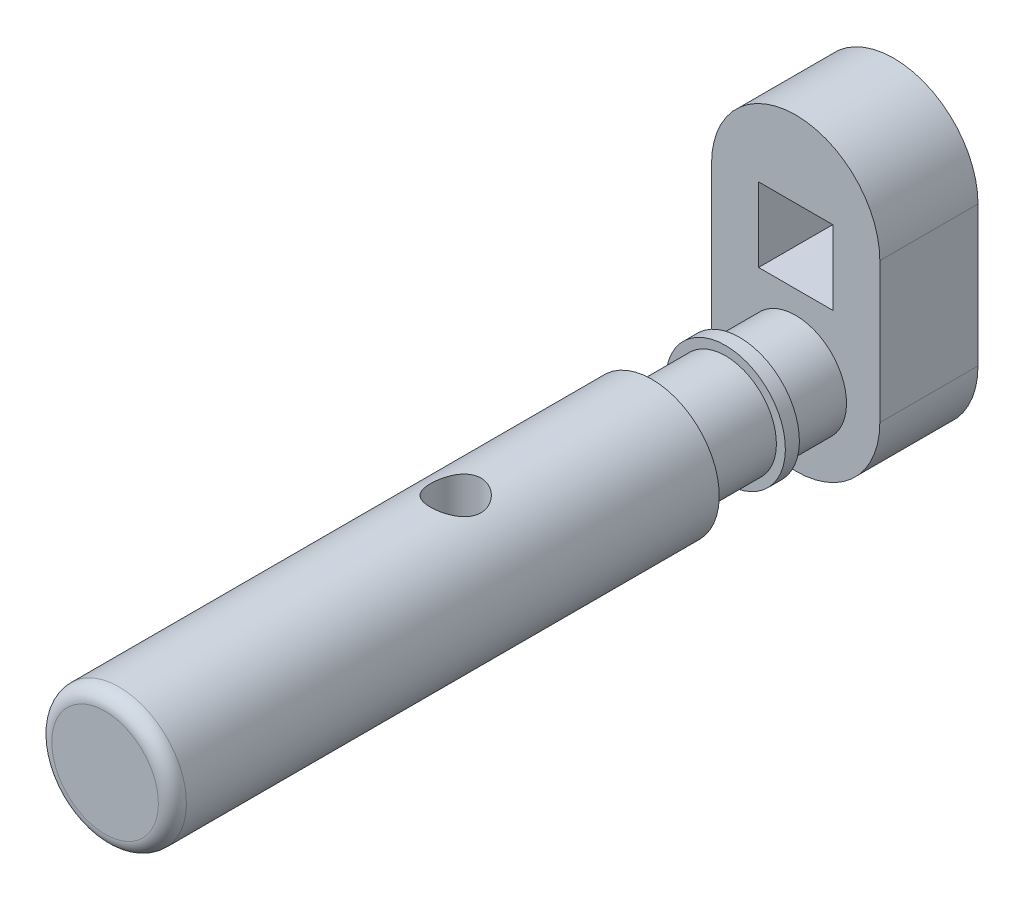
ISO-10303-21;
HEADER;
FILE_DESCRIPTION(('STEP AP214'),'2;1');
FILE_NAME('part.step','',(''),(''),'','','');
FILE_SCHEMA(('AUTOMOTIVE_DESIGN { 1 0 10303 214 1 1 1 1 }'));
ENDSEC;
DATA;
#1=APPLICATION_CONTEXT('core data for automotive mechanical design processes');
#2=APPLICATION_PROTOCOL_DEFINITION('international standard','automotive_design',2000,#1);
#3=PRODUCT_CONTEXT('',#1,'mechanical');
#4=PRODUCT('Part','Part','',(#3));
#5=PRODUCT_RELATED_PRODUCT_CATEGORY('part','',(#4));
#6=PRODUCT_DEFINITION_FORMATION('','',#4);
#7=PRODUCT_DEFINITION_CONTEXT('part definition',#1,'design');
#8=PRODUCT_DEFINITION('design','',#6,#7);
#9=PRODUCT_DEFINITION_SHAPE('','',#8);
#10=(LENGTH_UNIT() NAMED_UNIT(*) SI_UNIT(.MILLI.,.METRE.));
#11=(NAMED_UNIT(*) PLANE_ANGLE_UNIT() SI_UNIT($,.RADIAN.));
#12=(NAMED_UNIT(*) SI_UNIT($,.STERADIAN.) SOLID_ANGLE_UNIT());
#13=UNCERTAINTY_MEASURE_WITH_UNIT(LENGTH_MEASURE(1.E-05),#10,'distance_accuracy_value','');
#14=(GEOMETRIC_REPRESENTATION_CONTEXT(3) GLOBAL_UNCERTAINTY_ASSIGNED_CONTEXT((#13)) GLOBAL_UNIT_ASSIGNED_CONTEXT((#10,
#11,#12)) REPRESENTATION_CONTEXT('',''));
#15=CARTESIAN_POINT('',(0.,0.,0.));
#16=DIRECTION('',(0.,0.,1.));
#17=DIRECTION('',(1.,0.,0.));
#18=AXIS2_PLACEMENT_3D('',#15,#16,#17);
#19=CARTESIAN_POINT('',(0.,0.,7.));
#20=DIRECTION('',(0.,0.,1.));
#21=DIRECTION('',(1.,0.,0.));
#22=AXIS2_PLACEMENT_3D('',#19,#20,#21);
#23=PLANE('',#22);
#24=CARTESIAN_POINT('',(0.,-10.,7.));
#25=DIRECTION('',(0.,0.,-1.));
#26=DIRECTION('',(0.,1.,0.));
#27=AXIS2_PLACEMENT_3D('',#24,#25,#26);
#28=CIRCLE('',#27,3.625);
#29=CARTESIAN_POINT('',(0.,-6.375,7.));
#30=VERTEX_POINT('',#29);
#31=EDGE_CURVE('E136',#30,#30,#28,.T.);
#32=ORIENTED_EDGE('',*,*,#31,.T.);
#33=EDGE_LOOP('',(#32));
#34=FACE_BOUND('',#33,.T.);
#35=CARTESIAN_POINT('',(0.,0.,7.));
#36=DIRECTION('',(0.,0.,1.));
#37=DIRECTION('',(1.,0.,0.));
#38=AXIS2_PLACEMENT_3D('',#35,#36,#37);
#39=CIRCLE('',#38,6.);
#40=CARTESIAN_POINT('',(6.,0.,7.));
#41=VERTEX_POINT('',#40);
#42=CARTESIAN_POINT('',(-6.,0.,7.));
#43=VERTEX_POINT('',#42);
#44=EDGE_CURVE('E158',#41,#43,#39,.T.);
#45=ORIENTED_EDGE('',*,*,#44,.T.);
#46=DIRECTION('',(0.,-1.,0.));
#47=VECTOR('',#46,1.);
#48=CARTESIAN_POINT('',(-6.,0.,7.));
#49=LINE('',#48,#47);
#50=CARTESIAN_POINT('',(-6.,-10.,7.));
#51=VERTEX_POINT('',#50);
#52=EDGE_CURVE('E161',#43,#51,#49,.T.);
#53=ORIENTED_EDGE('',*,*,#52,.T.);
#54=CARTESIAN_POINT('',(0.,-10.,7.));
#55=DIRECTION('',(0.,0.,1.));
#56=DIRECTION('',(1.,0.,0.));
#57=AXIS2_PLACEMENT_3D('',#54,#55,#56);
#58=CIRCLE('',#57,6.);
#59=CARTESIAN_POINT('',(6.,-10.,7.));
#60=VERTEX_POINT('',#59);
#61=EDGE_CURVE('E164',#51,#60,#58,.T.);
#62=ORIENTED_EDGE('',*,*,#61,.T.);
#63=DIRECTION('',(0.,1.,0.));
#64=VECTOR('',#63,1.);
#65=CARTESIAN_POINT('',(6.,0.,7.));
#66=LINE('',#65,#64);
#67=EDGE_CURVE('E166',#60,#41,#66,.T.);
#68=ORIENTED_EDGE('',*,*,#67,.T.);
#69=EDGE_LOOP('',(#45,#53,#62,#68));
#70=FACE_BOUND('',#69,.T.);
#71=DIRECTION('',(-1.,0.,0.));
#72=VECTOR('',#71,1.);
#73=CARTESIAN_POINT('',(-2.644,0.544000000000001,7.));
#74=LINE('',#73,#72);
#75=CARTESIAN_POINT('',(2.644,0.544000000000001,7.));
#76=VERTEX_POINT('',#75);
#77=CARTESIAN_POINT('',(-2.644,0.544000000000001,7.));
#78=VERTEX_POINT('',#77);
#79=EDGE_CURVE('E135',#76,#78,#74,.T.);
#80=ORIENTED_EDGE('',*,*,#79,.F.);
#81=DIRECTION('',(0.,1.,0.));
#82=VECTOR('',#81,1.);
#83=CARTESIAN_POINT('',(2.644,-4.744,7.));
#84=LINE('',#83,#82);
#85=CARTESIAN_POINT('',(2.644,-4.744,7.));
#86=VERTEX_POINT('',#85);
#87=EDGE_CURVE('E125',#86,#76,#84,.T.);
#88=ORIENTED_EDGE('',*,*,#87,.F.);
#89=DIRECTION('',(1.,0.,0.));
#90=VECTOR('',#89,1.);
#91=CARTESIAN_POINT('',(-2.644,-4.744,7.));
#92=LINE('',#91,#90);
#93=CARTESIAN_POINT('',(-2.644,-4.744,7.));
#94=VERTEX_POINT('',#93);
#95=EDGE_CURVE('E149',#94,#86,#92,.T.);
#96=ORIENTED_EDGE('',*,*,#95,.F.);
#97=DIRECTION('',(0.,-1.,0.));
#98=VECTOR('',#97,1.);
#99=CARTESIAN_POINT('',(-2.644,-4.744,7.));
#100=LINE('',#99,#98);
#101=EDGE_CURVE('E147',#78,#94,#100,.T.);
#102=ORIENTED_EDGE('',*,*,#101,.F.);
#103=EDGE_LOOP('',(#80,#88,#96,#102));
#104=FACE_BOUND('',#103,.T.);
#105=ADVANCED_FACE('F39',(#34,#70,#104),#23,.T.);
#106=CARTESIAN_POINT('',(0.,0.,0.));
#107=DIRECTION('',(0.,0.,1.));
#108=DIRECTION('',(1.,0.,0.));
#109=AXIS2_PLACEMENT_3D('',#106,#107,#108);
#110=PLANE('',#109);
#111=DIRECTION('',(1.,0.,0.));
#112=VECTOR('',#111,1.);
#113=CARTESIAN_POINT('',(2.644,-5.744,0.));
#114=LINE('',#113,#112);
#115=CARTESIAN_POINT('',(-3.644,-5.744,0.));
#116=VERTEX_POINT('',#115);
#117=CARTESIAN_POINT('',(3.644,-5.744,0.));
#118=VERTEX_POINT('',#117);
#119=EDGE_CURVE('E191',#116,#118,#114,.T.);
#120=ORIENTED_EDGE('',*,*,#119,.T.);
#121=DIRECTION('',(0.,1.,0.));
#122=VECTOR('',#121,1.);
#123=CARTESIAN_POINT('',(3.644,0.544000000000001,0.));
#124=LINE('',#123,#122);
#125=CARTESIAN_POINT('',(3.644,1.544,0.));
#126=VERTEX_POINT('',#125);
#127=EDGE_CURVE('E193',#118,#126,#124,.T.);
#128=ORIENTED_EDGE('',*,*,#127,.T.);
#129=DIRECTION('',(-1.,0.,0.));
#130=VECTOR('',#129,1.);
#131=CARTESIAN_POINT('',(-2.644,1.544,0.));
#132=LINE('',#131,#130);
#133=CARTESIAN_POINT('',(-3.644,1.544,0.));
#134=VERTEX_POINT('',#133);
#135=EDGE_CURVE('E187',#126,#134,#132,.T.);
#136=ORIENTED_EDGE('',*,*,#135,.T.);
#137=DIRECTION('',(0.,-1.,0.));
#138=VECTOR('',#137,1.);
#139=CARTESIAN_POINT('',(-3.644,-4.744,0.));
#140=LINE('',#139,#138);
#141=EDGE_CURVE('E189',#134,#116,#140,.T.);
#142=ORIENTED_EDGE('',*,*,#141,.T.);
#143=EDGE_LOOP('',(#120,#128,#136,#142));
#144=FACE_BOUND('',#143,.T.);
#145=CARTESIAN_POINT('',(0.,0.,0.));
#146=DIRECTION('',(0.,0.,1.));
#147=DIRECTION('',(1.,0.,0.));
#148=AXIS2_PLACEMENT_3D('',#145,#146,#147);
#149=CIRCLE('',#148,6.);
#150=CARTESIAN_POINT('',(6.,0.,0.));
#151=VERTEX_POINT('',#150);
#152=CARTESIAN_POINT('',(-6.,0.,0.));
#153=VERTEX_POINT('',#152);
#154=EDGE_CURVE('E142',#151,#153,#149,.T.);
#155=ORIENTED_EDGE('',*,*,#154,.F.);
#156=DIRECTION('',(0.,1.,0.));
#157=VECTOR('',#156,1.);
#158=CARTESIAN_POINT('',(6.,0.,0.));
#159=LINE('',#158,#157);
#160=CARTESIAN_POINT('',(6.,-10.,0.));
#161=VERTEX_POINT('',#160);
#162=EDGE_CURVE('E162',#161,#151,#159,.T.);
#163=ORIENTED_EDGE('',*,*,#162,.F.);
#164=CARTESIAN_POINT('',(0.,-10.,0.));
#165=DIRECTION('',(0.,0.,1.));
#166=DIRECTION('',(1.,0.,0.));
#167=AXIS2_PLACEMENT_3D('',#164,#165,#166);
#168=CIRCLE('',#167,6.);
#169=CARTESIAN_POINT('',(-6.,-10.,0.));
#170=VERTEX_POINT('',#169);
#171=EDGE_CURVE('E173',#170,#161,#168,.T.);
#172=ORIENTED_EDGE('',*,*,#171,.F.);
#173=DIRECTION('',(0.,-1.,0.));
#174=VECTOR('',#173,1.);
#175=CARTESIAN_POINT('',(-6.,0.,0.));
#176=LINE('',#175,#174);
#177=EDGE_CURVE('E171',#153,#170,#176,.T.);
#178=ORIENTED_EDGE('',*,*,#177,.F.);
#179=EDGE_LOOP('',(#155,#163,#172,#178));
#180=FACE_BOUND('',#179,.T.);
#181=ADVANCED_FACE('F243',(#144,#180),#110,.F.);
#182=CARTESIAN_POINT('',(0.,0.,7.));
#183=DIRECTION('',(0.,0.,-1.));
#184=DIRECTION('',(-1.,0.,0.));
#185=AXIS2_PLACEMENT_3D('',#182,#183,#184);
#186=CYLINDRICAL_SURFACE('',#185,6.);
#187=ORIENTED_EDGE('',*,*,#154,.T.);
#188=DIRECTION('',(0.,0.,-1.));
#189=VECTOR('',#188,1.);
#190=CARTESIAN_POINT('',(-6.,0.,7.));
#191=LINE('',#190,#189);
#192=EDGE_CURVE('E184',#43,#153,#191,.T.);
#193=ORIENTED_EDGE('',*,*,#192,.F.);
#194=ORIENTED_EDGE('',*,*,#44,.F.);
#195=DIRECTION('',(0.,0.,-1.));
#196=VECTOR('',#195,1.);
#197=CARTESIAN_POINT('',(6.,0.,7.));
#198=LINE('',#197,#196);
#199=EDGE_CURVE('E168',#41,#151,#198,.T.);
#200=ORIENTED_EDGE('',*,*,#199,.T.);
#201=EDGE_LOOP('',(#187,#193,#194,#200));
#202=FACE_BOUND('',#201,.T.);
#203=ADVANCED_FACE('F251',(#202),#186,.T.);
#204=CARTESIAN_POINT('',(-6.,0.,7.));
#205=DIRECTION('',(1.,0.,0.));
#206=DIRECTION('',(0.,1.,0.));
#207=AXIS2_PLACEMENT_3D('',#204,#205,#206);
#208=PLANE('',#207);
#209=ORIENTED_EDGE('',*,*,#177,.T.);
#210=DIRECTION('',(0.,0.,-1.));
#211=VECTOR('',#210,1.);
#212=CARTESIAN_POINT('',(-6.,-10.,7.));
#213=LINE('',#212,#211);
#214=EDGE_CURVE('E181',#51,#170,#213,.T.);
#215=ORIENTED_EDGE('',*,*,#214,.F.);
#216=ORIENTED_EDGE('',*,*,#52,.F.);
#217=ORIENTED_EDGE('',*,*,#192,.T.);
#218=EDGE_LOOP('',(#209,#215,#216,#217));
#219=FACE_BOUND('',#218,.T.);
#220=ADVANCED_FACE('F265',(#219),#208,.F.);
#221=CARTESIAN_POINT('',(0.,-10.,7.));
#222=DIRECTION('',(0.,0.,-1.));
#223=DIRECTION('',(-1.,0.,0.));
#224=AXIS2_PLACEMENT_3D('',#221,#222,#223);
#225=CYLINDRICAL_SURFACE('',#224,6.);
#226=ORIENTED_EDGE('',*,*,#171,.T.);
#227=DIRECTION('',(0.,0.,-1.));
#228=VECTOR('',#227,1.);
#229=CARTESIAN_POINT('',(6.,-10.,7.));
#230=LINE('',#229,#228);
#231=EDGE_CURVE('E178',#60,#161,#230,.T.);
#232=ORIENTED_EDGE('',*,*,#231,.F.);
#233=ORIENTED_EDGE('',*,*,#61,.F.);
#234=ORIENTED_EDGE('',*,*,#214,.T.);
#235=EDGE_LOOP('',(#226,#232,#233,#234));
#236=FACE_BOUND('',#235,.T.);
#237=ADVANCED_FACE('F261',(#236),#225,.T.);
#238=CARTESIAN_POINT('',(6.,0.,7.));
#239=DIRECTION('',(-1.,0.,0.));
#240=DIRECTION('',(0.,0.,1.));
#241=AXIS2_PLACEMENT_3D('',#238,#239,#240);
#242=PLANE('',#241);
#243=ORIENTED_EDGE('',*,*,#162,.T.);
#244=ORIENTED_EDGE('',*,*,#199,.F.);
#245=ORIENTED_EDGE('',*,*,#67,.F.);
#246=ORIENTED_EDGE('',*,*,#231,.T.);
#247=EDGE_LOOP('',(#243,#244,#245,#246));
#248=FACE_BOUND('',#247,.T.);
#249=ADVANCED_FACE('F259',(#248),#242,.F.);
#250=CARTESIAN_POINT('',(2.644,-4.744,7.));
#251=DIRECTION('',(-1.,0.,0.));
#252=DIRECTION('',(0.,-1.,0.));
#253=AXIS2_PLACEMENT_3D('',#250,#251,#252);
#254=PLANE('',#253);
#255=DIRECTION('',(0.,0.,-1.));
#256=VECTOR('',#255,1.);
#257=CARTESIAN_POINT('',(2.644,0.544000000000001,7.));
#258=LINE('',#257,#256);
#259=CARTESIAN_POINT('',(2.644,0.544000000000001,1.));
#260=VERTEX_POINT('',#259);
#261=EDGE_CURVE('E129',#76,#260,#258,.T.);
#262=ORIENTED_EDGE('',*,*,#261,.T.);
#263=DIRECTION('',(0.,1.,0.));
#264=VECTOR('',#263,1.);
#265=CARTESIAN_POINT('',(2.644,-4.744,1.));
#266=LINE('',#265,#264);
#267=CARTESIAN_POINT('',(2.644,-4.744,1.));
#268=VERTEX_POINT('',#267);
#269=EDGE_CURVE('E196',#260,#268,#266,.F.);
#270=ORIENTED_EDGE('',*,*,#269,.T.);
#271=DIRECTION('',(0.,0.,-1.));
#272=VECTOR('',#271,1.);
#273=CARTESIAN_POINT('',(2.644,-4.744,7.));
#274=LINE('',#273,#272);
#275=EDGE_CURVE('E131',#86,#268,#274,.T.);
#276=ORIENTED_EDGE('',*,*,#275,.F.);
#277=ORIENTED_EDGE('',*,*,#87,.T.);
#278=EDGE_LOOP('',(#262,#270,#276,#277));
#279=FACE_BOUND('',#278,.T.);
#280=ADVANCED_FACE('F127',(#279),#254,.T.);
#281=CARTESIAN_POINT('',(-2.644,0.544000000000001,7.));
#282=DIRECTION('',(0.,-1.,0.));
#283=DIRECTION('',(0.,0.,-1.));
#284=AXIS2_PLACEMENT_3D('',#281,#282,#283);
#285=PLANE('',#284);
#286=DIRECTION('',(0.,0.,-1.));
#287=VECTOR('',#286,1.);
#288=CARTESIAN_POINT('',(-2.644,0.544000000000001,7.));
#289=LINE('',#288,#287);
#290=CARTESIAN_POINT('',(-2.644,0.544000000000001,1.));
#291=VERTEX_POINT('',#290);
#292=EDGE_CURVE('E143',#78,#291,#289,.T.);
#293=ORIENTED_EDGE('',*,*,#292,.T.);
#294=DIRECTION('',(-1.,0.,0.));
#295=VECTOR('',#294,1.);
#296=CARTESIAN_POINT('',(2.644,0.544000000000001,1.));
#297=LINE('',#296,#295);
#298=EDGE_CURVE('E141',#291,#260,#297,.F.);
#299=ORIENTED_EDGE('',*,*,#298,.T.);
#300=ORIENTED_EDGE('',*,*,#261,.F.);
#301=ORIENTED_EDGE('',*,*,#79,.T.);
#302=EDGE_LOOP('',(#293,#299,#300,#301));
#303=FACE_BOUND('',#302,.T.);
#304=ADVANCED_FACE('F139',(#303),#285,.T.);
#305=CARTESIAN_POINT('',(-2.644,-4.744,7.));
#306=DIRECTION('',(1.,0.,0.));
#307=DIRECTION('',(0.,0.,-1.));
#308=AXIS2_PLACEMENT_3D('',#305,#306,#307);
#309=PLANE('',#308);
#310=DIRECTION('',(0.,0.,-1.));
#311=VECTOR('',#310,1.);
#312=CARTESIAN_POINT('',(-2.644,-4.744,7.));
#313=LINE('',#312,#311);
#314=CARTESIAN_POINT('',(-2.644,-4.744,1.));
#315=VERTEX_POINT('',#314);
#316=EDGE_CURVE('E155',#94,#315,#313,.T.);
#317=ORIENTED_EDGE('',*,*,#316,.T.);
#318=DIRECTION('',(0.,-1.,0.));
#319=VECTOR('',#318,1.);
#320=CARTESIAN_POINT('',(-2.644,0.544000000000001,1.));
#321=LINE('',#320,#319);
#322=EDGE_CURVE('E60',#315,#291,#321,.F.);
#323=ORIENTED_EDGE('',*,*,#322,.T.);
#324=ORIENTED_EDGE('',*,*,#292,.F.);
#325=ORIENTED_EDGE('',*,*,#101,.T.);
#326=EDGE_LOOP('',(#317,#323,#324,#325));
#327=FACE_BOUND('',#326,.T.);
#328=ADVANCED_FACE('F293',(#327),#309,.T.);
#329=CARTESIAN_POINT('',(-2.644,-4.744,7.));
#330=DIRECTION('',(0.,1.,0.));
#331=DIRECTION('',(0.,0.,1.));
#332=AXIS2_PLACEMENT_3D('',#329,#330,#331);
#333=PLANE('',#332);
#334=ORIENTED_EDGE('',*,*,#275,.T.);
#335=DIRECTION('',(1.,0.,0.));
#336=VECTOR('',#335,1.);
#337=CARTESIAN_POINT('',(-2.644,-4.744,1.));
#338=LINE('',#337,#336);
#339=EDGE_CURVE('E68',#268,#315,#338,.F.);
#340=ORIENTED_EDGE('',*,*,#339,.T.);
#341=ORIENTED_EDGE('',*,*,#316,.F.);
#342=ORIENTED_EDGE('',*,*,#95,.T.);
#343=EDGE_LOOP('',(#334,#340,#341,#342));
#344=FACE_BOUND('',#343,.T.);
#345=ADVANCED_FACE('F292',(#344),#333,.T.);
#346=CARTESIAN_POINT('',(0.,-10.,7.));
#347=DIRECTION('',(0.,0.,-1.));
#348=DIRECTION('',(0.,1.,0.));
#349=AXIS2_PLACEMENT_3D('',#346,#347,#348);
#350=CYLINDRICAL_SURFACE('',#349,3.625);
#351=ORIENTED_EDGE('',*,*,#31,.F.);
#352=EDGE_LOOP('',(#351));
#353=FACE_BOUND('',#352,.T.);
#354=CARTESIAN_POINT('',(0.,-10.,11.));
#355=DIRECTION('',(0.,0.,-1.));
#356=DIRECTION('',(0.,1.,0.));
#357=AXIS2_PLACEMENT_3D('',#354,#355,#356);
#358=CIRCLE('',#357,3.625);
#359=CARTESIAN_POINT('',(0.,-6.375,11.));
#360=VERTEX_POINT('',#359);
#361=EDGE_CURVE('E343',#360,#360,#358,.T.);
#362=ORIENTED_EDGE('',*,*,#361,.T.);
#363=EDGE_LOOP('',(#362));
#364=FACE_BOUND('',#363,.T.);
#365=ADVANCED_FACE('F300',(#353,#364),#350,.T.);
#366=CARTESIAN_POINT('',(0.,-14.2645108906658,11.));
#367=DIRECTION('',(0.,0.,1.));
#368=DIRECTION('',(0.,-1.,0.));
#369=AXIS2_PLACEMENT_3D('',#366,#367,#368);
#370=PLANE('',#369);
#371=ORIENTED_EDGE('',*,*,#361,.F.);
#372=EDGE_LOOP('',(#371));
#373=FACE_BOUND('',#372,.T.);
#374=CARTESIAN_POINT('',(0.,-10.,11.));
#375=DIRECTION('',(0.,0.,-1.));
#376=DIRECTION('',(0.,1.,0.));
#377=AXIS2_PLACEMENT_3D('',#374,#375,#376);
#378=CIRCLE('',#377,4.26451089066583);
#379=CARTESIAN_POINT('',(0.,-5.73548910933417,11.));
#380=VERTEX_POINT('',#379);
#381=EDGE_CURVE('E340',#380,#380,#378,.T.);
#382=ORIENTED_EDGE('',*,*,#381,.T.);
#383=EDGE_LOOP('',(#382));
#384=FACE_BOUND('',#383,.T.);
#385=ADVANCED_FACE('F304',(#373,#384),#370,.F.);
#386=CARTESIAN_POINT('',(0.,-10.,7.));
#387=DIRECTION('',(0.,0.,-1.));
#388=DIRECTION('',(0.,1.,0.));
#389=AXIS2_PLACEMENT_3D('',#386,#387,#388);
#390=CYLINDRICAL_SURFACE('',#389,4.26451089066583);
#391=ORIENTED_EDGE('',*,*,#381,.F.);
#392=EDGE_LOOP('',(#391));
#393=FACE_BOUND('',#392,.T.);
#394=CARTESIAN_POINT('',(0.,-10.,12.));
#395=DIRECTION('',(0.,0.,-1.));
#396=DIRECTION('',(0.,1.,0.));
#397=AXIS2_PLACEMENT_3D('',#394,#395,#396);
#398=CIRCLE('',#397,4.26451089066583);
#399=CARTESIAN_POINT('',(0.,-5.73548910933417,12.));
#400=VERTEX_POINT('',#399);
#401=EDGE_CURVE('E337',#400,#400,#398,.T.);
#402=ORIENTED_EDGE('',*,*,#401,.T.);
#403=EDGE_LOOP('',(#402));
#404=FACE_BOUND('',#403,.T.);
#405=ADVANCED_FACE('F308',(#393,#404),#390,.T.);
#406=CARTESIAN_POINT('',(0.,-13.625,12.));
#407=DIRECTION('',(0.,0.,-1.));
#408=DIRECTION('',(0.,1.,0.));
#409=AXIS2_PLACEMENT_3D('',#406,#407,#408);
#410=PLANE('',#409);
#411=ORIENTED_EDGE('',*,*,#401,.F.);
#412=EDGE_LOOP('',(#411));
#413=FACE_BOUND('',#412,.T.);
#414=CARTESIAN_POINT('',(0.,-10.,12.));
#415=DIRECTION('',(0.,0.,-1.));
#416=DIRECTION('',(0.,1.,0.));
#417=AXIS2_PLACEMENT_3D('',#414,#415,#416);
#418=CIRCLE('',#417,3.625);
#419=CARTESIAN_POINT('',(0.,-6.375,12.));
#420=VERTEX_POINT('',#419);
#421=EDGE_CURVE('E332',#420,#420,#418,.T.);
#422=ORIENTED_EDGE('',*,*,#421,.T.);
#423=EDGE_LOOP('',(#422));
#424=FACE_BOUND('',#423,.T.);
#425=ADVANCED_FACE('F312',(#413,#424),#410,.F.);
#426=CARTESIAN_POINT('',(0.,-10.,7.));
#427=DIRECTION('',(0.,0.,-1.));
#428=DIRECTION('',(0.,1.,0.));
#429=AXIS2_PLACEMENT_3D('',#426,#427,#428);
#430=CYLINDRICAL_SURFACE('',#429,3.625);
#431=ORIENTED_EDGE('',*,*,#421,.F.);
#432=EDGE_LOOP('',(#431));
#433=FACE_BOUND('',#432,.T.);
#434=CARTESIAN_POINT('',(0.,-10.,17.25));
#435=DIRECTION('',(0.,0.,-1.));
#436=DIRECTION('',(0.,1.,0.));
#437=AXIS2_PLACEMENT_3D('',#434,#435,#436);
#438=CIRCLE('',#437,3.625);
#439=CARTESIAN_POINT('',(0.,-6.375,17.25));
#440=VERTEX_POINT('',#439);
#441=EDGE_CURVE('E327',#440,#440,#438,.T.);
#442=ORIENTED_EDGE('',*,*,#441,.T.);
#443=EDGE_LOOP('',(#442));
#444=FACE_BOUND('',#443,.T.);
#445=ADVANCED_FACE('F316',(#433,#444),#430,.T.);
#446=CARTESIAN_POINT('',(0.,-14.2645108906658,17.25));
#447=DIRECTION('',(0.,0.,1.));
#448=DIRECTION('',(0.,-1.,0.));
#449=AXIS2_PLACEMENT_3D('',#446,#447,#448);
#450=PLANE('',#449);
#451=ORIENTED_EDGE('',*,*,#441,.F.);
#452=EDGE_LOOP('',(#451));
#453=FACE_BOUND('',#452,.T.);
#454=CARTESIAN_POINT('',(0.,-10.,17.25));
#455=DIRECTION('',(0.,0.,-1.));
#456=DIRECTION('',(0.,1.,0.));
#457=AXIS2_PLACEMENT_3D('',#454,#455,#456);
#458=CIRCLE('',#457,4.8);
#459=CARTESIAN_POINT('',(0.,-5.2,17.25));
#460=VERTEX_POINT('',#459);
#461=EDGE_CURVE('E212',#460,#460,#458,.T.);
#462=ORIENTED_EDGE('',*,*,#461,.T.);
#463=EDGE_LOOP('',(#462));
#464=FACE_BOUND('',#463,.T.);
#465=ADVANCED_FACE('F240',(#453,#464),#450,.F.);
#466=CARTESIAN_POINT('',(0.,-10.,7.));
#467=DIRECTION('',(0.,0.,-1.));
#468=DIRECTION('',(0.,1.,0.));
#469=AXIS2_PLACEMENT_3D('',#466,#467,#468);
#470=CYLINDRICAL_SURFACE('',#469,4.8);
#471=CARTESIAN_POINT('',(0.,-14.8,33.0446183797221));
#472=CARTESIAN_POINT('',(0.0974820707254233,-14.8000026094738,33.0446218624859));
#473=CARTESIAN_POINT('',(0.19494029013815,-14.7970045513982,33.0366746674241));
#474=CARTESIAN_POINT('',(0.386944142822833,-14.7853443520831,33.0052245453982));
#475=CARTESIAN_POINT('',(0.481490193585139,-14.7766830267279,32.9817238591575));
#476=CARTESIAN_POINT('',(0.664872941989055,-14.7546259886985,32.920114777596));
#477=CARTESIAN_POINT('',(0.753720268994733,-14.7412394121933,32.882034559536));
#478=CARTESIAN_POINT('',(0.923759172192305,-14.7110652131842,32.7924906841032));
#479=CARTESIAN_POINT('',(1.00494868701346,-14.6942766787306,32.7410234370692));
#480=CARTESIAN_POINT('',(1.16081570045499,-14.6582349636546,32.6238833424371));
#481=CARTESIAN_POINT('',(1.23512487618143,-14.6389120310028,32.5577420650109));
#482=CARTESIAN_POINT('',(1.37189305769236,-14.6003226504559,32.4141258581315));
#483=CARTESIAN_POINT('',(1.43434843631043,-14.5810562216204,32.3366474724167));
#484=CARTESIAN_POINT('',(1.54797842659182,-14.5439496474128,32.1689574186943));
#485=CARTESIAN_POINT('',(1.59863271834912,-14.5261917858498,32.0783731398672));
#486=CARTESIAN_POINT('',(1.68382375600902,-14.4951983228492,31.8892003547199));
#487=CARTESIAN_POINT('',(1.71836693953487,-14.4819609157106,31.790615063936));
#488=CARTESIAN_POINT('',(1.76890117221059,-14.4622529538896,31.5924782914123));
#489=CARTESIAN_POINT('',(1.78559511862269,-14.4555270922101,31.4931323335996));
#490=CARTESIAN_POINT('',(1.80215467837977,-14.4488567375346,31.2928389901295));
#491=CARTESIAN_POINT('',(1.80202724163157,-14.4489094439117,31.1918922830728));
#492=CARTESIAN_POINT('',(1.78548515532022,-14.4555701395847,30.9976949494666));
#493=CARTESIAN_POINT('',(1.77004570210804,-14.4617856264535,30.9043452924691));
#494=CARTESIAN_POINT('',(1.72493001441996,-14.4794192567144,30.7216737992358));
#495=CARTESIAN_POINT('',(1.6952516359591,-14.4908381835864,30.6323525717855));
#496=CARTESIAN_POINT('',(1.62196498286284,-14.517828426283,30.4582858984483));
#497=CARTESIAN_POINT('',(1.57810378484521,-14.533474215858,30.3736589963766));
#498=CARTESIAN_POINT('',(1.47787288515237,-14.5671305216718,30.212683494613));
#499=CARTESIAN_POINT('',(1.42149886474676,-14.5851418534859,30.1363377666985));
#500=CARTESIAN_POINT('',(1.29338136919858,-14.6229764663094,29.9886939833411));
#501=CARTESIAN_POINT('',(1.22085958460346,-14.6428401694681,29.9180800108244));
#502=CARTESIAN_POINT('',(1.06477510898282,-14.681100737969,29.7898128202752));
#503=CARTESIAN_POINT('',(0.981210724196835,-14.6994973775914,29.7321615941953));
#504=CARTESIAN_POINT('',(0.803668124390902,-14.733116737709,29.6307019032471));
#505=CARTESIAN_POINT('',(0.709548856613662,-14.7482859791154,29.5871212822569));
#506=CARTESIAN_POINT('',(0.514604220629498,-14.7733446199235,29.5166392545981));
#507=CARTESIAN_POINT('',(0.413781853014919,-14.7832363640979,29.4897304398488));
#508=CARTESIAN_POINT('',(0.214050291778397,-14.7962133187368,29.4546710346718));
#509=CARTESIAN_POINT('',(0.11532434347465,-14.7996324283082,29.4455992520631));
#510=CARTESIAN_POINT('',(-0.0822869703060293,-14.8003107244015,29.4437891030422));
#511=CARTESIAN_POINT('',(-0.181172295580047,-14.7975712766424,29.451047115342));
#512=CARTESIAN_POINT('',(-0.37231445827423,-14.7864605172717,29.4809904304925));
#513=CARTESIAN_POINT('',(-0.464679993608801,-14.7783096515477,29.5030722322066));
#514=CARTESIAN_POINT('',(-0.644330105948663,-14.7574177251006,29.5612416667789));
#515=CARTESIAN_POINT('',(-0.73161402041704,-14.7446760673844,29.5973311212598));
#516=CARTESIAN_POINT('',(-0.901497318132186,-14.7153954928922,29.6836420746495));
#517=CARTESIAN_POINT('',(-0.983883700269353,-14.6987560025122,29.7342476547902));
#518=CARTESIAN_POINT('',(-1.13927125407195,-14.663520058776,29.847720103528));
#519=CARTESIAN_POINT('',(-1.21226894432454,-14.6449228841142,29.9105914987763));
#520=CARTESIAN_POINT('',(-1.35123695849345,-14.6064799538919,30.0511033262713));
#521=CARTESIAN_POINT('',(-1.41655384948282,-14.5866243580448,30.1293889990494));
#522=CARTESIAN_POINT('',(-1.53325260038284,-14.5489457889622,30.2962000413713));
#523=CARTESIAN_POINT('',(-1.58463320897422,-14.5311229983328,30.3847263293883));
#524=CARTESIAN_POINT('',(-1.67205328222797,-14.4996019578696,30.5702375638489));
#525=CARTESIAN_POINT('',(-1.70802822536302,-14.4859211239419,30.6672560748147));
#526=CARTESIAN_POINT('',(-1.76289460160267,-14.4646483946921,30.8666300961475));
#527=CARTESIAN_POINT('',(-1.78179660366642,-14.4570527326899,30.9689822631599));
#528=CARTESIAN_POINT('',(-1.80103616517407,-14.4493107375109,31.1690377711715));
#529=CARTESIAN_POINT('',(-1.80248797795005,-14.4487173342801,31.2666175377824));
#530=CARTESIAN_POINT('',(-1.78964058769911,-14.4539009529435,31.4605527592535));
#531=CARTESIAN_POINT('',(-1.77534287820148,-14.4596773707868,31.556908329328));
#532=CARTESIAN_POINT('',(-1.7322697875629,-14.4765776990252,31.742675051782));
#533=CARTESIAN_POINT('',(-1.70394957979829,-14.48753302452,31.8322083952166));
#534=CARTESIAN_POINT('',(-1.63403636135903,-14.5134585795741,32.0053049899154));
#535=CARTESIAN_POINT('',(-1.59243999533933,-14.5284298239426,32.0888667254063));
#536=CARTESIAN_POINT('',(-1.49462491125784,-14.5616766868476,32.2524105273593));
#537=CARTESIAN_POINT('',(-1.43775399363612,-14.5800843812916,32.331975335882));
#538=CARTESIAN_POINT('',(-1.31201382875887,-14.6176749610861,32.4807882528876));
#539=CARTESIAN_POINT('',(-1.24314076815369,-14.6368580913177,32.5500330694663));
#540=CARTESIAN_POINT('',(-1.09089647614155,-14.6750850953186,32.6800607267084));
#541=CARTESIAN_POINT('',(-1.00694237305559,-14.6940652588077,32.7401828838438));
#542=CARTESIAN_POINT('',(-0.829455867840986,-14.7286541734844,32.845445566054));
#543=CARTESIAN_POINT('',(-0.735922720908745,-14.7442626622187,32.8905849250058));
#544=CARTESIAN_POINT('',(-0.537598898402773,-14.7708915112802,32.9658705745801));
#545=CARTESIAN_POINT('',(-0.43249610668105,-14.7816838859003,32.9952828572444));
#546=CARTESIAN_POINT('',(-0.218250880327659,-14.796234906155,33.034649931627));
#547=CARTESIAN_POINT('',(-0.109110499637831,-14.7999970792476,33.0446144815069));
#548=CARTESIAN_POINT('',(0.,-14.8,33.0446183797221));
#549=B_SPLINE_CURVE_WITH_KNOTS('',3,(#471,#472,#473,#474,#475,#476,#477,#478,#479,#480,#481,
#482,#483,#484,#485,#486,#487,#488,#489,#490,#491,#492,#493,#494,#495,#496,#497,#498,#499,#500,
#501,#502,#503,#504,#505,#506,#507,#508,#509,#510,#511,#512,#513,#514,#515,#516,#517,#518,#519,
#520,#521,#522,#523,#524,#525,#526,#527,#528,#529,#530,#531,#532,#533,#534,#535,#536,#537,#538,
#539,#540,#541,#542,#543,#544,#545,#546,#547,#548),.UNSPECIFIED.,.T.,.F.,(4,2,2,2,2,2,2,2,2,2,2,
2,2,2,2,2,2,2,2,2,2,2,2,2,2,2,2,2,2,2,2,2,2,2,2,2,2,2,4),(0.,0.292043761872671,
0.584045459436554,0.875485643056289,1.16700405553139,1.46968342299259,1.77245525910746,
2.08676009401991,2.40093923222561,2.70223049300283,3.00339727295649,3.28654014143966,
3.56972565672707,3.85826890064422,4.14691188893111,4.45495384002976,4.76304309486079,
5.0758965034329,5.38861079638615,5.68470023563111,5.98072402068625,6.26537325508608,
6.55005951905344,6.84311066231519,7.13627016023841,7.44643823346789,7.75663414704169,
8.06811680072645,8.37940649947808,8.67070516176303,8.96197620253511,9.2443577091184,
9.52681063987808,9.82406966261126,10.1214233039647,10.4348679558485,10.7483369976612,
11.0753821803845,11.4022632215535),.UNSPECIFIED.);
#550=CARTESIAN_POINT('',(0.,-14.8,33.0446183797221));
#551=VERTEX_POINT('',#550);
#552=EDGE_CURVE('E43',#551,#551,#549,.T.);
#553=ORIENTED_EDGE('',*,*,#552,.T.);
#554=EDGE_LOOP('',(#553));
#555=FACE_BOUND('',#554,.T.);
#556=CARTESIAN_POINT('',(0.,-5.20000000000001,33.0446183797221));
#557=CARTESIAN_POINT('',(-0.0974820707254234,-5.19999739052619,33.0446218624859));
#558=CARTESIAN_POINT('',(-0.194940290138151,-5.20299544860179,33.0366746674241));
#559=CARTESIAN_POINT('',(-0.386944142822833,-5.21465564791687,33.0052245453982));
#560=CARTESIAN_POINT('',(-0.481490193585139,-5.22331697327208,32.9817238591575));
#561=CARTESIAN_POINT('',(-0.664872941989055,-5.24537401130147,32.920114777596));
#562=CARTESIAN_POINT('',(-0.753720268994734,-5.25876058780672,32.882034559536));
#563=CARTESIAN_POINT('',(-0.923759172192306,-5.28893478681576,32.7924906841032));
#564=CARTESIAN_POINT('',(-1.00494868701346,-5.30572332126943,32.7410234370692));
#565=CARTESIAN_POINT('',(-1.16081570045499,-5.3417650363454,32.6238833424371));
#566=CARTESIAN_POINT('',(-1.23512487618143,-5.36108796899721,32.5577420650109));
#567=CARTESIAN_POINT('',(-1.37189305769236,-5.39967734954408,32.4141258581315));
#568=CARTESIAN_POINT('',(-1.43434843631043,-5.41894377837961,32.3366474724167));
#569=CARTESIAN_POINT('',(-1.54797842659182,-5.45605035258722,32.1689574186943));
#570=CARTESIAN_POINT('',(-1.59863271834912,-5.47380821415018,32.0783731398672));
#571=CARTESIAN_POINT('',(-1.68382375600902,-5.5048016771508,31.8892003547199));
#572=CARTESIAN_POINT('',(-1.71836693953487,-5.51803908428943,31.790615063936));
#573=CARTESIAN_POINT('',(-1.76890117221059,-5.53774704611037,31.5924782914123));
#574=CARTESIAN_POINT('',(-1.78559511862269,-5.54447290778995,31.4931323335996));
#575=CARTESIAN_POINT('',(-1.80215467837977,-5.55114326246543,31.2928389901295));
#576=CARTESIAN_POINT('',(-1.80202724163156,-5.55109055608835,31.1918922830728));
#577=CARTESIAN_POINT('',(-1.78548515532022,-5.54442986041535,30.9976949494666));
#578=CARTESIAN_POINT('',(-1.77004570210804,-5.53821437354654,30.9043452924691));
#579=CARTESIAN_POINT('',(-1.72493001441996,-5.52058074328565,30.7216737992358));
#580=CARTESIAN_POINT('',(-1.6952516359591,-5.50916181641364,30.6323525717855));
#581=CARTESIAN_POINT('',(-1.62196498286284,-5.48217157371697,30.4582858984483));
#582=CARTESIAN_POINT('',(-1.57810378484521,-5.46652578414201,30.3736589963766));
#583=CARTESIAN_POINT('',(-1.47787288515237,-5.43286947832817,30.212683494613));
#584=CARTESIAN_POINT('',(-1.42149886474676,-5.41485814651411,30.1363377666985));
#585=CARTESIAN_POINT('',(-1.29338136919858,-5.37702353369065,29.9886939833411));
#586=CARTESIAN_POINT('',(-1.22085958460346,-5.35715983053195,29.9180800108244));
#587=CARTESIAN_POINT('',(-1.06477510898282,-5.31889926203097,29.7898128202752));
#588=CARTESIAN_POINT('',(-0.981210724196835,-5.30050262240858,29.7321615941953));
#589=CARTESIAN_POINT('',(-0.803668124390902,-5.26688326229104,29.6307019032471));
#590=CARTESIAN_POINT('',(-0.709548856613662,-5.25171402088461,29.5871212822569));
#591=CARTESIAN_POINT('',(-0.514604220629498,-5.22665538007646,29.5166392545981));
#592=CARTESIAN_POINT('',(-0.413781853014919,-5.21676363590208,29.4897304398488));
#593=CARTESIAN_POINT('',(-0.214050291778397,-5.20378668126322,29.4546710346718));
#594=CARTESIAN_POINT('',(-0.11532434347465,-5.20036757169177,29.4455992520631));
#595=CARTESIAN_POINT('',(0.0822869703060298,-5.19968927559849,29.4437891030422));
#596=CARTESIAN_POINT('',(0.181172295580048,-5.20242872335764,29.451047115342));
#597=CARTESIAN_POINT('',(0.372314458274232,-5.21353948272828,29.4809904304926));
#598=CARTESIAN_POINT('',(0.464679993608804,-5.22169034845234,29.5030722322066));
#599=CARTESIAN_POINT('',(0.644330105948666,-5.2425822748994,29.5612416667789));
#600=CARTESIAN_POINT('',(0.731614020417042,-5.25532393261564,29.5973311212598));
#601=CARTESIAN_POINT('',(0.901497318132187,-5.28460450710782,29.6836420746495));
#602=CARTESIAN_POINT('',(0.983883700269355,-5.30124399748782,29.7342476547902));
#603=CARTESIAN_POINT('',(1.13927125407195,-5.33647994122403,29.847720103528));
#604=CARTESIAN_POINT('',(1.21226894432454,-5.35507711588581,29.9105914987763));
#605=CARTESIAN_POINT('',(1.35123695849345,-5.39352004610813,30.0511033262713));
#606=CARTESIAN_POINT('',(1.41655384948282,-5.41337564195525,30.1293889990494));
#607=CARTESIAN_POINT('',(1.53325260038284,-5.45105421103776,30.2962000413713));
#608=CARTESIAN_POINT('',(1.58463320897422,-5.46887700166721,30.3847263293883));
#609=CARTESIAN_POINT('',(1.67205328222797,-5.50039804213044,30.5702375638489));
#610=CARTESIAN_POINT('',(1.70802822536302,-5.51407887605808,30.6672560748147));
#611=CARTESIAN_POINT('',(1.76289460160267,-5.53535160530794,30.8666300961475));
#612=CARTESIAN_POINT('',(1.78179660366642,-5.54294726731011,30.9689822631599));
#613=CARTESIAN_POINT('',(1.80103616517407,-5.55068926248912,31.1690377711715));
#614=CARTESIAN_POINT('',(1.80248797795005,-5.55128266571991,31.2666175377824));
#615=CARTESIAN_POINT('',(1.78964058769911,-5.5460990470565,31.4605527592535));
#616=CARTESIAN_POINT('',(1.77534287820148,-5.54032262921322,31.556908329328));
#617=CARTESIAN_POINT('',(1.7322697875629,-5.52342230097481,31.742675051782));
#618=CARTESIAN_POINT('',(1.70394957979829,-5.51246697548005,31.8322083952166));
#619=CARTESIAN_POINT('',(1.63403636135903,-5.48654142042586,32.0053049899154));
#620=CARTESIAN_POINT('',(1.59243999533933,-5.47157017605743,32.0888667254063));
#621=CARTESIAN_POINT('',(1.49462491125784,-5.43832331315243,32.2524105273593));
#622=CARTESIAN_POINT('',(1.43775399363612,-5.41991561870843,32.331975335882));
#623=CARTESIAN_POINT('',(1.31201382875887,-5.38232503891387,32.4807882528876));
#624=CARTESIAN_POINT('',(1.2431407681537,-5.36314190868226,32.5500330694662));
#625=CARTESIAN_POINT('',(1.09089647614155,-5.32491490468143,32.6800607267084));
#626=CARTESIAN_POINT('',(1.00694237305559,-5.30593474119227,32.7401828838438));
#627=CARTESIAN_POINT('',(0.829455867840983,-5.27134582651563,32.845445566054));
#628=CARTESIAN_POINT('',(0.735922720908744,-5.25573733778129,32.8905849250058));
#629=CARTESIAN_POINT('',(0.537598898402772,-5.22910848871984,32.9658705745801));
#630=CARTESIAN_POINT('',(0.432496106681047,-5.21831611409973,32.9952828572444));
#631=CARTESIAN_POINT('',(0.218250880327656,-5.20376509384496,33.034649931627));
#632=CARTESIAN_POINT('',(0.10911049963783,-5.2000029207524,33.0446144815069));
#633=CARTESIAN_POINT('',(0.,-5.20000000000001,33.0446183797221));
#634=B_SPLINE_CURVE_WITH_KNOTS('',3,(#556,#557,#558,#559,#560,#561,#562,#563,#564,#565,#566,
#567,#568,#569,#570,#571,#572,#573,#574,#575,#576,#577,#578,#579,#580,#581,#582,#583,#584,#585,
#586,#587,#588,#589,#590,#591,#592,#593,#594,#595,#596,#597,#598,#599,#600,#601,#602,#603,#604,
#605,#606,#607,#608,#609,#610,#611,#612,#613,#614,#615,#616,#617,#618,#619,#620,#621,#622,#623,
#624,#625,#626,#627,#628,#629,#630,#631,#632,#633),.UNSPECIFIED.,.T.,.F.,(4,2,2,2,2,2,2,2,2,2,2,
2,2,2,2,2,2,2,2,2,2,2,2,2,2,2,2,2,2,2,2,2,2,2,2,2,2,2,4),(0.,0.292043761872671,
0.584045459436554,0.875485643056289,1.16700405553139,1.46968342299259,1.77245525910746,
2.08676009401991,2.40093923222561,2.70223049300283,3.00339727295649,3.28654014143966,
3.56972565672707,3.85826890064422,4.14691188893111,4.45495384002976,4.76304309486079,
5.0758965034329,5.38861079638615,5.6847002356311,5.98072402068625,6.26537325508608,
6.55005951905344,6.84311066231519,7.13627016023841,7.44643823346789,7.75663414704169,
8.06811680072644,8.37940649947808,8.67070516176303,8.96197620253511,9.2443577091184,
9.52681063987808,9.82406966261125,10.1214233039647,10.4348679558485,10.7483369976612,
11.0753821803845,11.4022632215535),.UNSPECIFIED.);
#635=CARTESIAN_POINT('',(0.,-5.20000000000001,33.0446183797221));
#636=VERTEX_POINT('',#635);
#637=EDGE_CURVE('E11',#636,#636,#634,.T.);
#638=ORIENTED_EDGE('',*,*,#637,.T.);
#639=EDGE_LOOP('',(#638));
#640=FACE_BOUND('',#639,.T.);
#641=CARTESIAN_POINT('',(0.,-10.,55.2446183797221));
#642=DIRECTION('',(0.,0.,-1.));
#643=DIRECTION('',(0.,1.,0.));
#644=AXIS2_PLACEMENT_3D('',#641,#642,#643);
#645=CIRCLE('',#644,4.8);
#646=CARTESIAN_POINT('',(0.,-5.2,55.2446183797221));
#647=VERTEX_POINT('',#646);
#648=EDGE_CURVE('E201',#647,#647,#645,.T.);
#649=ORIENTED_EDGE('',*,*,#648,.T.);
#650=EDGE_LOOP('',(#649));
#651=FACE_BOUND('',#650,.T.);
#652=ORIENTED_EDGE('',*,*,#461,.F.);
#653=EDGE_LOOP('',(#652));
#654=FACE_BOUND('',#653,.T.);
#655=ADVANCED_FACE('F219',(#555,#640,#651,#654),#470,.T.);
#656=CARTESIAN_POINT('',(0.,-13.625,56.2446183797221));
#657=DIRECTION('',(0.,0.,-1.));
#658=DIRECTION('',(0.,1.,0.));
#659=AXIS2_PLACEMENT_3D('',#656,#657,#658);
#660=PLANE('',#659);
#661=CARTESIAN_POINT('',(0.,-10.,56.2446183797221));
#662=DIRECTION('',(0.,0.,-1.));
#663=DIRECTION('',(0.,1.,0.));
#664=AXIS2_PLACEMENT_3D('',#661,#662,#663);
#665=CIRCLE('',#664,3.8);
#666=CARTESIAN_POINT('',(0.,-6.2,56.2446183797221));
#667=VERTEX_POINT('',#666);
#668=EDGE_CURVE('E53',#667,#667,#665,.F.);
#669=ORIENTED_EDGE('',*,*,#668,.T.);
#670=EDGE_LOOP('',(#669));
#671=FACE_BOUND('',#670,.T.);
#672=ADVANCED_FACE('F227',(#671),#660,.F.);
#673=CARTESIAN_POINT('',(-3.644,0.,1.));
#674=DIRECTION('',(0.,1.,0.));
#675=DIRECTION('',(0.,0.,1.));
#676=AXIS2_PLACEMENT_3D('',#673,#674,#675);
#677=CYLINDRICAL_SURFACE('',#676,1.);
#678=CARTESIAN_POINT('',(-3.644,1.544,1.));
#679=DIRECTION('',(0.707106781186547,0.707106781186547,0.));
#680=DIRECTION('',(-0.707106781186547,0.707106781186547,0.));
#681=AXIS2_PLACEMENT_3D('',#678,#679,#680);
#682=ELLIPSE('',#681,1.41421356237309,1.);
#683=EDGE_CURVE('E206',#291,#134,#682,.T.);
#684=ORIENTED_EDGE('',*,*,#683,.F.);
#685=ORIENTED_EDGE('',*,*,#322,.F.);
#686=CARTESIAN_POINT('',(-3.644,-5.744,1.));
#687=DIRECTION('',(-0.707106781186547,0.707106781186547,0.));
#688=DIRECTION('',(-0.707106781186547,-0.707106781186547,0.));
#689=AXIS2_PLACEMENT_3D('',#686,#687,#688);
#690=ELLIPSE('',#689,1.41421356237309,1.);
#691=EDGE_CURVE('E209',#116,#315,#690,.F.);
#692=ORIENTED_EDGE('',*,*,#691,.F.);
#693=ORIENTED_EDGE('',*,*,#141,.F.);
#694=EDGE_LOOP('',(#684,#685,#692,#693));
#695=FACE_BOUND('',#694,.T.);
#696=ADVANCED_FACE('F230',(#695),#677,.T.);
#697=CARTESIAN_POINT('',(0.,-5.744,1.));
#698=DIRECTION('',(-1.,0.,0.));
#699=DIRECTION('',(0.,0.,1.));
#700=AXIS2_PLACEMENT_3D('',#697,#698,#699);
#701=CYLINDRICAL_SURFACE('',#700,1.);
#702=ORIENTED_EDGE('',*,*,#691,.T.);
#703=ORIENTED_EDGE('',*,*,#339,.F.);
#704=CARTESIAN_POINT('',(3.644,-5.744,1.));
#705=DIRECTION('',(-0.707106781186547,-0.707106781186548,0.));
#706=DIRECTION('',(0.707106781186548,-0.707106781186547,0.));
#707=AXIS2_PLACEMENT_3D('',#704,#705,#706);
#708=ELLIPSE('',#707,1.4142135623731,1.);
#709=EDGE_CURVE('E204',#118,#268,#708,.F.);
#710=ORIENTED_EDGE('',*,*,#709,.F.);
#711=ORIENTED_EDGE('',*,*,#119,.F.);
#712=EDGE_LOOP('',(#702,#703,#710,#711));
#713=FACE_BOUND('',#712,.T.);
#714=ADVANCED_FACE('F237',(#713),#701,.T.);
#715=CARTESIAN_POINT('',(0.,1.544,1.));
#716=DIRECTION('',(1.,0.,0.));
#717=DIRECTION('',(0.,0.,-1.));
#718=AXIS2_PLACEMENT_3D('',#715,#716,#717);
#719=CYLINDRICAL_SURFACE('',#718,1.);
#720=ORIENTED_EDGE('',*,*,#683,.T.);
#721=ORIENTED_EDGE('',*,*,#135,.F.);
#722=CARTESIAN_POINT('',(3.644,1.544,1.));
#723=DIRECTION('',(0.707106781186548,-0.707106781186547,0.));
#724=DIRECTION('',(-0.707106781186547,-0.707106781186548,0.));
#725=AXIS2_PLACEMENT_3D('',#722,#723,#724);
#726=ELLIPSE('',#725,1.41421356237309,1.);
#727=EDGE_CURVE('E202',#260,#126,#726,.T.);
#728=ORIENTED_EDGE('',*,*,#727,.F.);
#729=ORIENTED_EDGE('',*,*,#298,.F.);
#730=EDGE_LOOP('',(#720,#721,#728,#729));
#731=FACE_BOUND('',#730,.T.);
#732=ADVANCED_FACE('F275',(#731),#719,.T.);
#733=CARTESIAN_POINT('',(3.644,0.,1.));
#734=DIRECTION('',(0.,-1.,0.));
#735=DIRECTION('',(1.,0.,0.));
#736=AXIS2_PLACEMENT_3D('',#733,#734,#735);
#737=CYLINDRICAL_SURFACE('',#736,1.);
#738=ORIENTED_EDGE('',*,*,#709,.T.);
#739=ORIENTED_EDGE('',*,*,#269,.F.);
#740=ORIENTED_EDGE('',*,*,#727,.T.);
#741=ORIENTED_EDGE('',*,*,#127,.F.);
#742=EDGE_LOOP('',(#738,#739,#740,#741));
#743=FACE_BOUND('',#742,.T.);
#744=ADVANCED_FACE('F273',(#743),#737,.T.);
#745=CARTESIAN_POINT('',(0.,-10.,55.2446183797221));
#746=DIRECTION('',(0.,0.,-1.));
#747=DIRECTION('',(0.,1.,0.));
#748=AXIS2_PLACEMENT_3D('',#745,#746,#747);
#749=TOROIDAL_SURFACE('',#748,3.8,1.);
#750=ORIENTED_EDGE('',*,*,#668,.F.);
#751=EDGE_LOOP('',(#750));
#752=FACE_BOUND('',#751,.T.);
#753=ORIENTED_EDGE('',*,*,#648,.F.);
#754=EDGE_LOOP('',(#753));
#755=FACE_BOUND('',#754,.T.);
#756=ADVANCED_FACE('F41',(#752,#755),#749,.T.);
#757=CARTESIAN_POINT('',(0.,-16.,31.2446183797221));
#758=DIRECTION('',(0.,1.,0.));
#759=DIRECTION('',(0.,0.,1.));
#760=AXIS2_PLACEMENT_3D('',#757,#758,#759);
#761=CYLINDRICAL_SURFACE('',#760,1.8);
#762=ORIENTED_EDGE('',*,*,#552,.F.);
#763=EDGE_LOOP('',(#762));
#764=FACE_BOUND('',#763,.T.);
#765=ORIENTED_EDGE('',*,*,#637,.F.);
#766=EDGE_LOOP('',(#765));
#767=FACE_BOUND('',#766,.T.);
#768=ADVANCED_FACE('F223',(#764,#767),#761,.F.);
#769=CLOSED_SHELL('',(#105,#181,#203,#220,#237,#249,#280,#304,#328,#345,#365,#385,#405,#425,
#445,#465,#655,#672,#696,#714,#732,#744,#756,#768));
#770=MANIFOLD_SOLID_BREP('B2',#769);
#771=ADVANCED_BREP_SHAPE_REPRESENTATION('',(#18,#770),#14);
#772=SHAPE_DEFINITION_REPRESENTATION(#9,#771);
ENDSEC;
END-ISO-10303-21;
